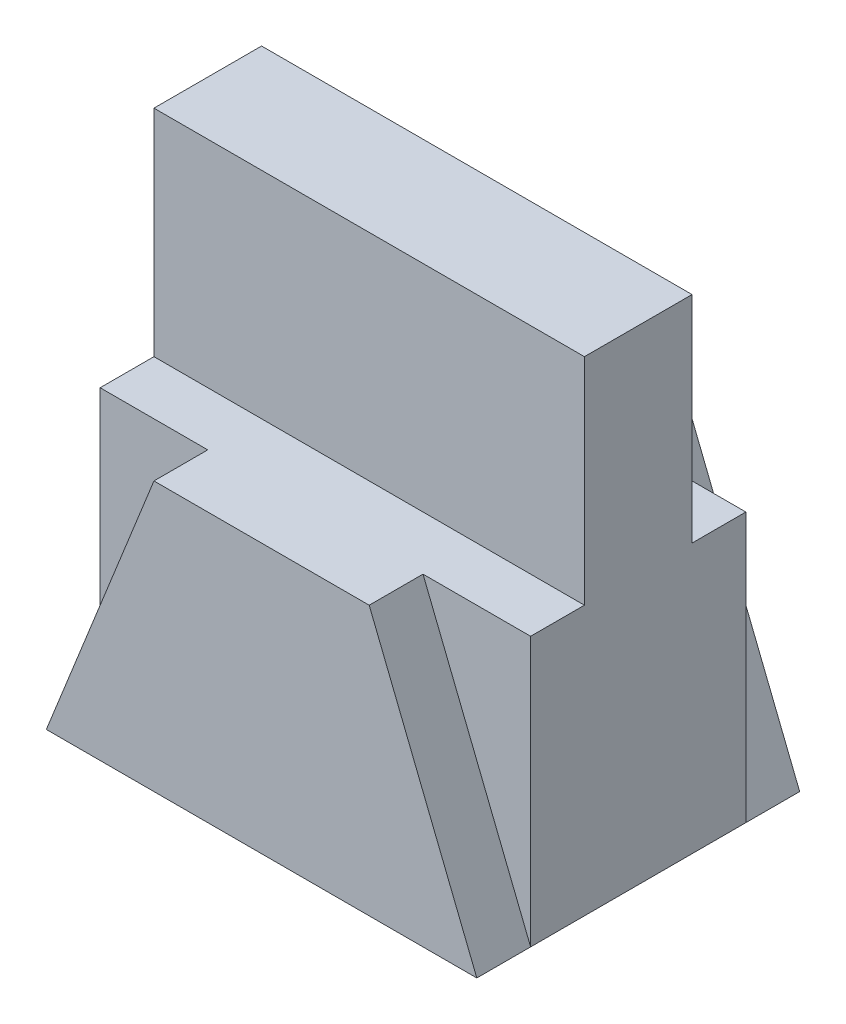
ISO-10303-21;
HEADER;
FILE_DESCRIPTION(('STEP AP214'),'2;1');
FILE_NAME('part.step','',(''),(''),'','','');
FILE_SCHEMA(('AUTOMOTIVE_DESIGN { 1 0 10303 214 1 1 1 1 }'));
ENDSEC;
DATA;
#1=APPLICATION_CONTEXT('core data for automotive mechanical design processes');
#2=APPLICATION_PROTOCOL_DEFINITION('international standard','automotive_design',2000,#1);
#3=PRODUCT_CONTEXT('',#1,'mechanical');
#4=PRODUCT('Part','Part','',(#3));
#5=PRODUCT_RELATED_PRODUCT_CATEGORY('part','',(#4));
#6=PRODUCT_DEFINITION_FORMATION('','',#4);
#7=PRODUCT_DEFINITION_CONTEXT('part definition',#1,'design');
#8=PRODUCT_DEFINITION('design','',#6,#7);
#9=PRODUCT_DEFINITION_SHAPE('','',#8);
#10=(LENGTH_UNIT() NAMED_UNIT(*) SI_UNIT(.MILLI.,.METRE.));
#11=(NAMED_UNIT(*) PLANE_ANGLE_UNIT() SI_UNIT($,.RADIAN.));
#12=(NAMED_UNIT(*) SI_UNIT($,.STERADIAN.) SOLID_ANGLE_UNIT());
#13=UNCERTAINTY_MEASURE_WITH_UNIT(LENGTH_MEASURE(1.E-05),#10,'distance_accuracy_value','');
#14=(GEOMETRIC_REPRESENTATION_CONTEXT(3) GLOBAL_UNCERTAINTY_ASSIGNED_CONTEXT((#13)) GLOBAL_UNIT_ASSIGNED_CONTEXT((#10,
#11,#12)) REPRESENTATION_CONTEXT('',''));
#15=CARTESIAN_POINT('',(0.,0.,0.));
#16=DIRECTION('',(0.,0.,1.));
#17=DIRECTION('',(1.,0.,0.));
#18=AXIS2_PLACEMENT_3D('',#15,#16,#17);
#19=CARTESIAN_POINT('',(20.,0.,-15.));
#20=DIRECTION('',(0.,0.,1.));
#21=DIRECTION('',(0.,-1.,0.));
#22=AXIS2_PLACEMENT_3D('',#19,#20,#21);
#23=PLANE('',#22);
#24=DIRECTION('',(0.371390676354103,-0.928476690885259,0.));
#25=VECTOR('',#24,1.);
#26=CARTESIAN_POINT('',(20.,0.,-15.));
#27=LINE('',#26,#25);
#28=CARTESIAN_POINT('',(10.,25.,-15.));
#29=VERTEX_POINT('',#28);
#30=CARTESIAN_POINT('',(20.,0.,-15.));
#31=VERTEX_POINT('',#30);
#32=EDGE_CURVE('E140',#29,#31,#27,.T.);
#33=ORIENTED_EDGE('',*,*,#32,.T.);
#34=DIRECTION('',(-1.,0.,0.));
#35=VECTOR('',#34,1.);
#36=CARTESIAN_POINT('',(20.,0.,-15.));
#37=LINE('',#36,#35);
#38=CARTESIAN_POINT('',(-20.,0.,-15.));
#39=VERTEX_POINT('',#38);
#40=EDGE_CURVE('E41',#31,#39,#37,.T.);
#41=ORIENTED_EDGE('',*,*,#40,.T.);
#42=DIRECTION('',(0.371390676354104,0.928476690885259,0.));
#43=VECTOR('',#42,1.);
#44=CARTESIAN_POINT('',(-10.,25.,-15.));
#45=LINE('',#44,#43);
#46=CARTESIAN_POINT('',(-10.,25.,-15.));
#47=VERTEX_POINT('',#46);
#48=EDGE_CURVE('E156',#39,#47,#45,.T.);
#49=ORIENTED_EDGE('',*,*,#48,.T.);
#50=DIRECTION('',(-1.,0.,0.));
#51=VECTOR('',#50,1.);
#52=CARTESIAN_POINT('',(20.,25.,-15.));
#53=LINE('',#52,#51);
#54=EDGE_CURVE('E240',#29,#47,#53,.T.);
#55=ORIENTED_EDGE('',*,*,#54,.F.);
#56=EDGE_LOOP('',(#33,#41,#49,#55));
#57=FACE_BOUND('',#56,.T.);
#58=ADVANCED_FACE('F33',(#57),#23,.F.);
#59=CARTESIAN_POINT('',(20.,25.,-15.));
#60=DIRECTION('',(0.,-1.,0.));
#61=DIRECTION('',(0.,0.,-1.));
#62=AXIS2_PLACEMENT_3D('',#59,#60,#61);
#63=PLANE('',#62);
#64=DIRECTION('',(0.,0.,-1.));
#65=VECTOR('',#64,1.);
#66=CARTESIAN_POINT('',(10.,25.,-10.));
#67=LINE('',#66,#65);
#68=CARTESIAN_POINT('',(10.,25.,-10.));
#69=VERTEX_POINT('',#68);
#70=EDGE_CURVE('E135',#69,#29,#67,.T.);
#71=ORIENTED_EDGE('',*,*,#70,.T.);
#72=ORIENTED_EDGE('',*,*,#54,.T.);
#73=DIRECTION('',(0.,0.,-1.));
#74=VECTOR('',#73,1.);
#75=CARTESIAN_POINT('',(-10.,25.,-10.));
#76=LINE('',#75,#74);
#77=CARTESIAN_POINT('',(-10.,25.,-10.));
#78=VERTEX_POINT('',#77);
#79=EDGE_CURVE('E166',#78,#47,#76,.T.);
#80=ORIENTED_EDGE('',*,*,#79,.F.);
#81=DIRECTION('',(-1.,0.,0.));
#82=VECTOR('',#81,1.);
#83=CARTESIAN_POINT('',(-20.,25.,-10.));
#84=LINE('',#83,#82);
#85=CARTESIAN_POINT('',(-20.,25.,-10.));
#86=VERTEX_POINT('',#85);
#87=EDGE_CURVE('E161',#78,#86,#84,.T.);
#88=ORIENTED_EDGE('',*,*,#87,.T.);
#89=DIRECTION('',(0.,0.,1.));
#90=VECTOR('',#89,1.);
#91=CARTESIAN_POINT('',(-20.,25.,-15.));
#92=LINE('',#91,#90);
#93=CARTESIAN_POINT('',(-20.,25.,-5.));
#94=VERTEX_POINT('',#93);
#95=EDGE_CURVE('E216',#86,#94,#92,.T.);
#96=ORIENTED_EDGE('',*,*,#95,.T.);
#97=DIRECTION('',(-1.,0.,0.));
#98=VECTOR('',#97,1.);
#99=CARTESIAN_POINT('',(20.,25.,-5.));
#100=LINE('',#99,#98);
#101=CARTESIAN_POINT('',(20.,25.,-5.));
#102=VERTEX_POINT('',#101);
#103=EDGE_CURVE('E237',#102,#94,#100,.T.);
#104=ORIENTED_EDGE('',*,*,#103,.F.);
#105=DIRECTION('',(0.,0.,1.));
#106=VECTOR('',#105,1.);
#107=CARTESIAN_POINT('',(20.,25.,-15.));
#108=LINE('',#107,#106);
#109=CARTESIAN_POINT('',(20.,25.,-9.99999999999999));
#110=VERTEX_POINT('',#109);
#111=EDGE_CURVE('E151',#110,#102,#108,.T.);
#112=ORIENTED_EDGE('',*,*,#111,.F.);
#113=DIRECTION('',(-1.,0.,0.));
#114=VECTOR('',#113,1.);
#115=CARTESIAN_POINT('',(10.,25.,-10.));
#116=LINE('',#115,#114);
#117=EDGE_CURVE('E48',#110,#69,#116,.T.);
#118=ORIENTED_EDGE('',*,*,#117,.T.);
#119=EDGE_LOOP('',(#71,#72,#80,#88,#96,#104,#112,#118));
#120=FACE_BOUND('',#119,.T.);
#121=ADVANCED_FACE('F149',(#120),#63,.F.);
#122=CARTESIAN_POINT('',(20.,25.,15.));
#123=DIRECTION('',(0.,0.,-1.));
#124=DIRECTION('',(0.,1.,0.));
#125=AXIS2_PLACEMENT_3D('',#122,#123,#124);
#126=PLANE('',#125);
#127=DIRECTION('',(-1.,0.,0.));
#128=VECTOR('',#127,1.);
#129=CARTESIAN_POINT('',(20.,0.,15.));
#130=LINE('',#129,#128);
#131=CARTESIAN_POINT('',(20.,0.,15.));
#132=VERTEX_POINT('',#131);
#133=CARTESIAN_POINT('',(-20.,0.,15.));
#134=VERTEX_POINT('',#133);
#135=EDGE_CURVE('E11',#132,#134,#130,.T.);
#136=ORIENTED_EDGE('',*,*,#135,.F.);
#137=DIRECTION('',(0.371390676354103,-0.928476690885259,0.));
#138=VECTOR('',#137,1.);
#139=CARTESIAN_POINT('',(20.,0.,15.));
#140=LINE('',#139,#138);
#141=CARTESIAN_POINT('',(10.,25.,15.));
#142=VERTEX_POINT('',#141);
#143=EDGE_CURVE('E170',#142,#132,#140,.T.);
#144=ORIENTED_EDGE('',*,*,#143,.F.);
#145=DIRECTION('',(-1.,0.,0.));
#146=VECTOR('',#145,1.);
#147=CARTESIAN_POINT('',(20.,25.,15.));
#148=LINE('',#147,#146);
#149=CARTESIAN_POINT('',(-10.,25.,15.));
#150=VERTEX_POINT('',#149);
#151=EDGE_CURVE('E212',#142,#150,#148,.T.);
#152=ORIENTED_EDGE('',*,*,#151,.T.);
#153=DIRECTION('',(0.371390676354104,0.928476690885259,0.));
#154=VECTOR('',#153,1.);
#155=CARTESIAN_POINT('',(-10.,25.,15.));
#156=LINE('',#155,#154);
#157=EDGE_CURVE('E183',#134,#150,#156,.T.);
#158=ORIENTED_EDGE('',*,*,#157,.F.);
#159=EDGE_LOOP('',(#136,#144,#152,#158));
#160=FACE_BOUND('',#159,.T.);
#161=ADVANCED_FACE('F35',(#160),#126,.F.);
#162=CARTESIAN_POINT('',(20.,0.,15.));
#163=DIRECTION('',(0.,1.,0.));
#164=DIRECTION('',(0.,0.,1.));
#165=AXIS2_PLACEMENT_3D('',#162,#163,#164);
#166=PLANE('',#165);
#167=DIRECTION('',(0.,0.,-1.));
#168=VECTOR('',#167,1.);
#169=CARTESIAN_POINT('',(-20.,0.,15.));
#170=LINE('',#169,#168);
#171=CARTESIAN_POINT('',(-20.,0.,10.));
#172=VERTEX_POINT('',#171);
#173=EDGE_CURVE('E213',#134,#172,#170,.T.);
#174=ORIENTED_EDGE('',*,*,#173,.T.);
#175=CARTESIAN_POINT('',(-20.,0.,-10.));
#176=VERTEX_POINT('',#175);
#177=EDGE_CURVE('E197',#172,#176,#170,.T.);
#178=ORIENTED_EDGE('',*,*,#177,.T.);
#179=DIRECTION('',(0.,0.,-1.));
#180=VECTOR('',#179,1.);
#181=CARTESIAN_POINT('',(-20.,0.,-10.));
#182=LINE('',#181,#180);
#183=EDGE_CURVE('E56',#176,#39,#182,.T.);
#184=ORIENTED_EDGE('',*,*,#183,.T.);
#185=ORIENTED_EDGE('',*,*,#40,.F.);
#186=DIRECTION('',(0.,0.,-1.));
#187=VECTOR('',#186,1.);
#188=CARTESIAN_POINT('',(20.,0.,-10.));
#189=LINE('',#188,#187);
#190=CARTESIAN_POINT('',(20.,0.,-10.));
#191=VERTEX_POINT('',#190);
#192=EDGE_CURVE('E143',#191,#31,#189,.T.);
#193=ORIENTED_EDGE('',*,*,#192,.F.);
#194=DIRECTION('',(0.,0.,-1.));
#195=VECTOR('',#194,1.);
#196=CARTESIAN_POINT('',(20.,0.,15.));
#197=LINE('',#196,#195);
#198=CARTESIAN_POINT('',(20.,0.,9.99999999999999));
#199=VERTEX_POINT('',#198);
#200=EDGE_CURVE('E201',#199,#191,#197,.T.);
#201=ORIENTED_EDGE('',*,*,#200,.F.);
#202=EDGE_CURVE('E198',#132,#199,#197,.T.);
#203=ORIENTED_EDGE('',*,*,#202,.F.);
#204=ORIENTED_EDGE('',*,*,#135,.T.);
#205=EDGE_LOOP('',(#174,#178,#184,#185,#193,#201,#203,#204));
#206=FACE_BOUND('',#205,.T.);
#207=ADVANCED_FACE('F245',(#206),#166,.F.);
#208=CARTESIAN_POINT('',(20.,25.,-5.));
#209=DIRECTION('',(0.,0.,1.));
#210=DIRECTION('',(0.,-1.,0.));
#211=AXIS2_PLACEMENT_3D('',#208,#209,#210);
#212=PLANE('',#211);
#213=DIRECTION('',(0.,1.,0.));
#214=VECTOR('',#213,1.);
#215=CARTESIAN_POINT('',(-20.,25.,-5.));
#216=LINE('',#215,#214);
#217=CARTESIAN_POINT('',(-20.,45.,-5.));
#218=VERTEX_POINT('',#217);
#219=EDGE_CURVE('E218',#94,#218,#216,.T.);
#220=ORIENTED_EDGE('',*,*,#219,.T.);
#221=DIRECTION('',(-1.,0.,0.));
#222=VECTOR('',#221,1.);
#223=CARTESIAN_POINT('',(20.,45.,-5.));
#224=LINE('',#223,#222);
#225=CARTESIAN_POINT('',(20.,45.,-5.));
#226=VERTEX_POINT('',#225);
#227=EDGE_CURVE('E234',#226,#218,#224,.T.);
#228=ORIENTED_EDGE('',*,*,#227,.F.);
#229=DIRECTION('',(0.,1.,0.));
#230=VECTOR('',#229,1.);
#231=CARTESIAN_POINT('',(20.,25.,-5.));
#232=LINE('',#231,#230);
#233=EDGE_CURVE('E203',#102,#226,#232,.T.);
#234=ORIENTED_EDGE('',*,*,#233,.F.);
#235=ORIENTED_EDGE('',*,*,#103,.T.);
#236=EDGE_LOOP('',(#220,#228,#234,#235));
#237=FACE_BOUND('',#236,.T.);
#238=ADVANCED_FACE('F280',(#237),#212,.F.);
#239=CARTESIAN_POINT('',(20.,45.,-5.));
#240=DIRECTION('',(0.,-1.,0.));
#241=DIRECTION('',(0.,0.,-1.));
#242=AXIS2_PLACEMENT_3D('',#239,#240,#241);
#243=PLANE('',#242);
#244=DIRECTION('',(0.,0.,1.));
#245=VECTOR('',#244,1.);
#246=CARTESIAN_POINT('',(-20.,45.,-5.));
#247=LINE('',#246,#245);
#248=CARTESIAN_POINT('',(-20.,45.,5.));
#249=VERTEX_POINT('',#248);
#250=EDGE_CURVE('E220',#218,#249,#247,.T.);
#251=ORIENTED_EDGE('',*,*,#250,.T.);
#252=DIRECTION('',(-1.,0.,0.));
#253=VECTOR('',#252,1.);
#254=CARTESIAN_POINT('',(20.,45.,5.));
#255=LINE('',#254,#253);
#256=CARTESIAN_POINT('',(20.,45.,5.));
#257=VERTEX_POINT('',#256);
#258=EDGE_CURVE('E231',#257,#249,#255,.T.);
#259=ORIENTED_EDGE('',*,*,#258,.F.);
#260=DIRECTION('',(0.,0.,1.));
#261=VECTOR('',#260,1.);
#262=CARTESIAN_POINT('',(20.,45.,-5.));
#263=LINE('',#262,#261);
#264=EDGE_CURVE('E205',#226,#257,#263,.T.);
#265=ORIENTED_EDGE('',*,*,#264,.F.);
#266=ORIENTED_EDGE('',*,*,#227,.T.);
#267=EDGE_LOOP('',(#251,#259,#265,#266));
#268=FACE_BOUND('',#267,.T.);
#269=ADVANCED_FACE('F285',(#268),#243,.F.);
#270=CARTESIAN_POINT('',(20.,45.,5.));
#271=DIRECTION('',(0.,0.,-1.));
#272=DIRECTION('',(0.,1.,0.));
#273=AXIS2_PLACEMENT_3D('',#270,#271,#272);
#274=PLANE('',#273);
#275=DIRECTION('',(0.,-1.,0.));
#276=VECTOR('',#275,1.);
#277=CARTESIAN_POINT('',(-20.,45.,5.));
#278=LINE('',#277,#276);
#279=CARTESIAN_POINT('',(-20.,25.,5.));
#280=VERTEX_POINT('',#279);
#281=EDGE_CURVE('E222',#249,#280,#278,.T.);
#282=ORIENTED_EDGE('',*,*,#281,.T.);
#283=DIRECTION('',(-1.,0.,0.));
#284=VECTOR('',#283,1.);
#285=CARTESIAN_POINT('',(20.,25.,5.));
#286=LINE('',#285,#284);
#287=CARTESIAN_POINT('',(20.,25.,5.));
#288=VERTEX_POINT('',#287);
#289=EDGE_CURVE('E228',#288,#280,#286,.T.);
#290=ORIENTED_EDGE('',*,*,#289,.F.);
#291=DIRECTION('',(0.,-1.,0.));
#292=VECTOR('',#291,1.);
#293=CARTESIAN_POINT('',(20.,45.,5.));
#294=LINE('',#293,#292);
#295=EDGE_CURVE('E207',#257,#288,#294,.T.);
#296=ORIENTED_EDGE('',*,*,#295,.F.);
#297=ORIENTED_EDGE('',*,*,#258,.T.);
#298=EDGE_LOOP('',(#282,#290,#296,#297));
#299=FACE_BOUND('',#298,.T.);
#300=ADVANCED_FACE('F313',(#299),#274,.F.);
#301=CARTESIAN_POINT('',(20.,25.,5.));
#302=DIRECTION('',(0.,-1.,0.));
#303=DIRECTION('',(0.,0.,-1.));
#304=AXIS2_PLACEMENT_3D('',#301,#302,#303);
#305=PLANE('',#304);
#306=ORIENTED_EDGE('',*,*,#151,.F.);
#307=DIRECTION('',(0.,0.,1.));
#308=VECTOR('',#307,1.);
#309=CARTESIAN_POINT('',(10.,25.,10.));
#310=LINE('',#309,#308);
#311=CARTESIAN_POINT('',(10.,25.,10.));
#312=VERTEX_POINT('',#311);
#313=EDGE_CURVE('E180',#312,#142,#310,.T.);
#314=ORIENTED_EDGE('',*,*,#313,.F.);
#315=DIRECTION('',(-1.,0.,0.));
#316=VECTOR('',#315,1.);
#317=CARTESIAN_POINT('',(10.,25.,10.));
#318=LINE('',#317,#316);
#319=CARTESIAN_POINT('',(20.,25.,10.));
#320=VERTEX_POINT('',#319);
#321=EDGE_CURVE('E177',#320,#312,#318,.T.);
#322=ORIENTED_EDGE('',*,*,#321,.F.);
#323=DIRECTION('',(0.,0.,1.));
#324=VECTOR('',#323,1.);
#325=CARTESIAN_POINT('',(20.,25.,5.));
#326=LINE('',#325,#324);
#327=EDGE_CURVE('E209',#288,#320,#326,.T.);
#328=ORIENTED_EDGE('',*,*,#327,.F.);
#329=ORIENTED_EDGE('',*,*,#289,.T.);
#330=DIRECTION('',(0.,0.,1.));
#331=VECTOR('',#330,1.);
#332=CARTESIAN_POINT('',(-20.,25.,5.));
#333=LINE('',#332,#331);
#334=CARTESIAN_POINT('',(-20.,25.,10.));
#335=VERTEX_POINT('',#334);
#336=EDGE_CURVE('E224',#280,#335,#333,.T.);
#337=ORIENTED_EDGE('',*,*,#336,.T.);
#338=DIRECTION('',(-1.,0.,0.));
#339=VECTOR('',#338,1.);
#340=CARTESIAN_POINT('',(-20.,25.,10.));
#341=LINE('',#340,#339);
#342=CARTESIAN_POINT('',(-10.,25.,10.));
#343=VERTEX_POINT('',#342);
#344=EDGE_CURVE('E190',#343,#335,#341,.T.);
#345=ORIENTED_EDGE('',*,*,#344,.F.);
#346=DIRECTION('',(0.,0.,1.));
#347=VECTOR('',#346,1.);
#348=CARTESIAN_POINT('',(-10.,25.,10.));
#349=LINE('',#348,#347);
#350=EDGE_CURVE('E192',#343,#150,#349,.T.);
#351=ORIENTED_EDGE('',*,*,#350,.T.);
#352=EDGE_LOOP('',(#306,#314,#322,#328,#329,#337,#345,#351));
#353=FACE_BOUND('',#352,.T.);
#354=ADVANCED_FACE('F303',(#353),#305,.F.);
#355=CARTESIAN_POINT('',(20.,0.,0.));
#356=DIRECTION('',(1.,0.,0.));
#357=DIRECTION('',(0.,0.,-1.));
#358=AXIS2_PLACEMENT_3D('',#355,#356,#357);
#359=PLANE('',#358);
#360=DIRECTION('',(0.,1.,0.));
#361=VECTOR('',#360,1.);
#362=CARTESIAN_POINT('',(20.,25.,-10.));
#363=LINE('',#362,#361);
#364=EDGE_CURVE('E144',#191,#110,#363,.T.);
#365=ORIENTED_EDGE('',*,*,#364,.T.);
#366=ORIENTED_EDGE('',*,*,#111,.T.);
#367=ORIENTED_EDGE('',*,*,#233,.T.);
#368=ORIENTED_EDGE('',*,*,#264,.T.);
#369=ORIENTED_EDGE('',*,*,#295,.T.);
#370=ORIENTED_EDGE('',*,*,#327,.T.);
#371=DIRECTION('',(0.,1.,0.));
#372=VECTOR('',#371,1.);
#373=CARTESIAN_POINT('',(20.,25.,10.));
#374=LINE('',#373,#372);
#375=EDGE_CURVE('E175',#199,#320,#374,.T.);
#376=ORIENTED_EDGE('',*,*,#375,.F.);
#377=ORIENTED_EDGE('',*,*,#200,.T.);
#378=EDGE_LOOP('',(#365,#366,#367,#368,#369,#370,#376,#377));
#379=FACE_BOUND('',#378,.T.);
#380=ADVANCED_FACE('F298',(#379),#359,.T.);
#381=CARTESIAN_POINT('',(-20.,0.,0.));
#382=DIRECTION('',(1.,0.,0.));
#383=DIRECTION('',(0.,0.,-1.));
#384=AXIS2_PLACEMENT_3D('',#381,#382,#383);
#385=PLANE('',#384);
#386=ORIENTED_EDGE('',*,*,#95,.F.);
#387=DIRECTION('',(0.,-1.,0.));
#388=VECTOR('',#387,1.);
#389=CARTESIAN_POINT('',(-20.,0.,-10.));
#390=LINE('',#389,#388);
#391=EDGE_CURVE('E158',#86,#176,#390,.T.);
#392=ORIENTED_EDGE('',*,*,#391,.T.);
#393=ORIENTED_EDGE('',*,*,#177,.F.);
#394=DIRECTION('',(0.,-1.,0.));
#395=VECTOR('',#394,1.);
#396=CARTESIAN_POINT('',(-20.,0.,10.));
#397=LINE('',#396,#395);
#398=EDGE_CURVE('E184',#335,#172,#397,.T.);
#399=ORIENTED_EDGE('',*,*,#398,.F.);
#400=ORIENTED_EDGE('',*,*,#336,.F.);
#401=ORIENTED_EDGE('',*,*,#281,.F.);
#402=ORIENTED_EDGE('',*,*,#250,.F.);
#403=ORIENTED_EDGE('',*,*,#219,.F.);
#404=EDGE_LOOP('',(#386,#392,#393,#399,#400,#401,#402,#403));
#405=FACE_BOUND('',#404,.T.);
#406=ADVANCED_FACE('F253',(#405),#385,.F.);
#407=CARTESIAN_POINT('',(-10.,25.,10.));
#408=DIRECTION('',(0.928476690885259,-0.371390676354104,0.));
#409=DIRECTION('',(0.371390676354104,0.928476690885259,0.));
#410=AXIS2_PLACEMENT_3D('',#407,#408,#409);
#411=PLANE('',#410);
#412=ORIENTED_EDGE('',*,*,#157,.T.);
#413=ORIENTED_EDGE('',*,*,#350,.F.);
#414=DIRECTION('',(0.371390676354104,0.928476690885259,0.));
#415=VECTOR('',#414,1.);
#416=CARTESIAN_POINT('',(-10.,25.,10.));
#417=LINE('',#416,#415);
#418=EDGE_CURVE('E187',#172,#343,#417,.T.);
#419=ORIENTED_EDGE('',*,*,#418,.F.);
#420=ORIENTED_EDGE('',*,*,#173,.F.);
#421=EDGE_LOOP('',(#412,#413,#419,#420));
#422=FACE_BOUND('',#421,.T.);
#423=ADVANCED_FACE('F306',(#422),#411,.F.);
#424=CARTESIAN_POINT('',(0.,0.,10.));
#425=DIRECTION('',(0.,0.,-1.));
#426=DIRECTION('',(-1.,0.,0.));
#427=AXIS2_PLACEMENT_3D('',#424,#425,#426);
#428=PLANE('',#427);
#429=ORIENTED_EDGE('',*,*,#398,.T.);
#430=ORIENTED_EDGE('',*,*,#418,.T.);
#431=ORIENTED_EDGE('',*,*,#344,.T.);
#432=EDGE_LOOP('',(#429,#430,#431));
#433=FACE_BOUND('',#432,.T.);
#434=ADVANCED_FACE('F308',(#433),#428,.F.);
#435=CARTESIAN_POINT('',(20.,0.,10.));
#436=DIRECTION('',(-0.928476690885259,-0.371390676354103,0.));
#437=DIRECTION('',(0.371390676354103,-0.928476690885259,0.));
#438=AXIS2_PLACEMENT_3D('',#435,#436,#437);
#439=PLANE('',#438);
#440=ORIENTED_EDGE('',*,*,#143,.T.);
#441=ORIENTED_EDGE('',*,*,#202,.T.);
#442=DIRECTION('',(0.371390676354103,-0.928476690885259,0.));
#443=VECTOR('',#442,1.);
#444=CARTESIAN_POINT('',(20.,0.,10.));
#445=LINE('',#444,#443);
#446=EDGE_CURVE('E173',#312,#199,#445,.T.);
#447=ORIENTED_EDGE('',*,*,#446,.F.);
#448=ORIENTED_EDGE('',*,*,#313,.T.);
#449=EDGE_LOOP('',(#440,#441,#447,#448));
#450=FACE_BOUND('',#449,.T.);
#451=ADVANCED_FACE('F269',(#450),#439,.F.);
#452=CARTESIAN_POINT('',(0.,0.,9.99999999999999));
#453=DIRECTION('',(0.,0.,-1.));
#454=DIRECTION('',(-1.,0.,0.));
#455=AXIS2_PLACEMENT_3D('',#452,#453,#454);
#456=PLANE('',#455);
#457=ORIENTED_EDGE('',*,*,#446,.T.);
#458=ORIENTED_EDGE('',*,*,#375,.T.);
#459=ORIENTED_EDGE('',*,*,#321,.T.);
#460=EDGE_LOOP('',(#457,#458,#459));
#461=FACE_BOUND('',#460,.T.);
#462=ADVANCED_FACE('F262',(#461),#456,.F.);
#463=CARTESIAN_POINT('',(-10.,25.,-10.));
#464=DIRECTION('',(-0.928476690885259,0.371390676354104,0.));
#465=DIRECTION('',(-0.371390676354104,-0.928476690885259,0.));
#466=AXIS2_PLACEMENT_3D('',#463,#464,#465);
#467=PLANE('',#466);
#468=ORIENTED_EDGE('',*,*,#48,.F.);
#469=ORIENTED_EDGE('',*,*,#183,.F.);
#470=DIRECTION('',(0.371390676354104,0.928476690885259,0.));
#471=VECTOR('',#470,1.);
#472=CARTESIAN_POINT('',(-10.,25.,-10.));
#473=LINE('',#472,#471);
#474=EDGE_CURVE('E164',#176,#78,#473,.T.);
#475=ORIENTED_EDGE('',*,*,#474,.T.);
#476=ORIENTED_EDGE('',*,*,#79,.T.);
#477=EDGE_LOOP('',(#468,#469,#475,#476));
#478=FACE_BOUND('',#477,.T.);
#479=ADVANCED_FACE('F260',(#478),#467,.T.);
#480=CARTESIAN_POINT('',(0.,0.,-10.));
#481=DIRECTION('',(0.,0.,1.));
#482=DIRECTION('',(-1.,0.,0.));
#483=AXIS2_PLACEMENT_3D('',#480,#481,#482);
#484=PLANE('',#483);
#485=ORIENTED_EDGE('',*,*,#391,.F.);
#486=ORIENTED_EDGE('',*,*,#87,.F.);
#487=ORIENTED_EDGE('',*,*,#474,.F.);
#488=EDGE_LOOP('',(#485,#486,#487));
#489=FACE_BOUND('',#488,.T.);
#490=ADVANCED_FACE('F258',(#489),#484,.F.);
#491=CARTESIAN_POINT('',(20.,0.,-10.));
#492=DIRECTION('',(0.928476690885259,0.371390676354103,0.));
#493=DIRECTION('',(-0.371390676354103,0.928476690885259,0.));
#494=AXIS2_PLACEMENT_3D('',#491,#492,#493);
#495=PLANE('',#494);
#496=ORIENTED_EDGE('',*,*,#32,.F.);
#497=ORIENTED_EDGE('',*,*,#70,.F.);
#498=DIRECTION('',(0.371390676354103,-0.928476690885259,0.));
#499=VECTOR('',#498,1.);
#500=CARTESIAN_POINT('',(20.,0.,-10.));
#501=LINE('',#500,#499);
#502=EDGE_CURVE('E137',#69,#191,#501,.T.);
#503=ORIENTED_EDGE('',*,*,#502,.T.);
#504=ORIENTED_EDGE('',*,*,#192,.T.);
#505=EDGE_LOOP('',(#496,#497,#503,#504));
#506=FACE_BOUND('',#505,.T.);
#507=ADVANCED_FACE('F136',(#506),#495,.T.);
#508=CARTESIAN_POINT('',(0.,0.,-9.99999999999999));
#509=DIRECTION('',(0.,0.,1.));
#510=DIRECTION('',(-1.,0.,0.));
#511=AXIS2_PLACEMENT_3D('',#508,#509,#510);
#512=PLANE('',#511);
#513=ORIENTED_EDGE('',*,*,#502,.F.);
#514=ORIENTED_EDGE('',*,*,#117,.F.);
#515=ORIENTED_EDGE('',*,*,#364,.F.);
#516=EDGE_LOOP('',(#513,#514,#515));
#517=FACE_BOUND('',#516,.T.);
#518=ADVANCED_FACE('F146',(#517),#512,.F.);
#519=CLOSED_SHELL('',(#58,#121,#161,#207,#238,#269,#300,#354,#380,#406,#423,#434,#451,#462,#479,
#490,#507,#518));
#520=MANIFOLD_SOLID_BREP('B2',#519);
#521=ADVANCED_BREP_SHAPE_REPRESENTATION('',(#18,#520),#14);
#522=SHAPE_DEFINITION_REPRESENTATION(#9,#521);
ENDSEC;
END-ISO-10303-21;
